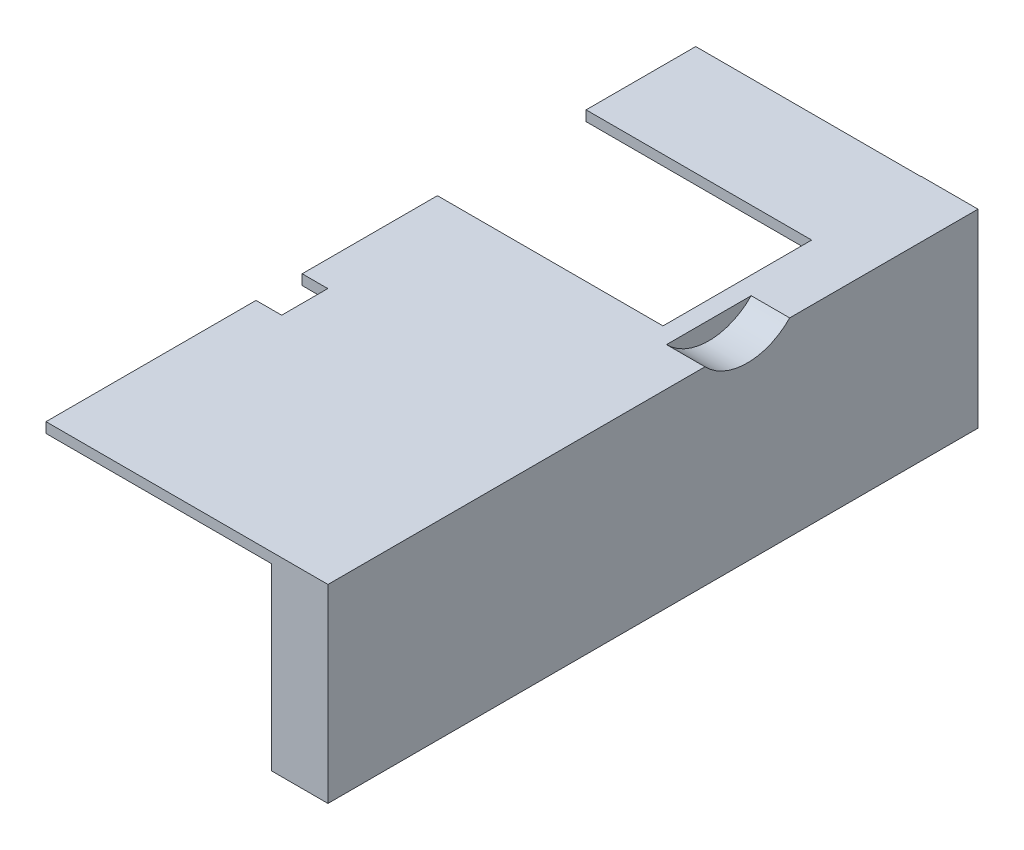
ISO-10303-21;
HEADER;
FILE_DESCRIPTION(('STEP AP214'),'2;1');
FILE_NAME('part.step','',(''),(''),'','','');
FILE_SCHEMA(('AUTOMOTIVE_DESIGN { 1 0 10303 214 1 1 1 1 }'));
ENDSEC;
DATA;
#1=APPLICATION_CONTEXT('core data for automotive mechanical design processes');
#2=APPLICATION_PROTOCOL_DEFINITION('international standard','automotive_design',2000,#1);
#3=PRODUCT_CONTEXT('',#1,'mechanical');
#4=PRODUCT('Part','Part','',(#3));
#5=PRODUCT_RELATED_PRODUCT_CATEGORY('part','',(#4));
#6=PRODUCT_DEFINITION_FORMATION('','',#4);
#7=PRODUCT_DEFINITION_CONTEXT('part definition',#1,'design');
#8=PRODUCT_DEFINITION('design','',#6,#7);
#9=PRODUCT_DEFINITION_SHAPE('','',#8);
#10=(LENGTH_UNIT() NAMED_UNIT(*) SI_UNIT(.MILLI.,.METRE.));
#11=(NAMED_UNIT(*) PLANE_ANGLE_UNIT() SI_UNIT($,.RADIAN.));
#12=(NAMED_UNIT(*) SI_UNIT($,.STERADIAN.) SOLID_ANGLE_UNIT());
#13=UNCERTAINTY_MEASURE_WITH_UNIT(LENGTH_MEASURE(1.E-05),#10,'distance_accuracy_value','');
#14=(GEOMETRIC_REPRESENTATION_CONTEXT(3) GLOBAL_UNCERTAINTY_ASSIGNED_CONTEXT((#13)) GLOBAL_UNIT_ASSIGNED_CONTEXT((#10,
#11,#12)) REPRESENTATION_CONTEXT('',''));
#15=CARTESIAN_POINT('',(0.,0.,0.));
#16=DIRECTION('',(0.,0.,1.));
#17=DIRECTION('',(1.,0.,0.));
#18=AXIS2_PLACEMENT_3D('',#15,#16,#17);
#19=CARTESIAN_POINT('',(52.5,-23.5,-45.0594239487394));
#20=DIRECTION('',(0.,0.,-1.));
#21=DIRECTION('',(-1.,0.,0.));
#22=AXIS2_PLACEMENT_3D('',#19,#20,#21);
#23=PLANE('',#22);
#24=DIRECTION('',(-1.,0.,0.));
#25=VECTOR('',#24,1.);
#26=CARTESIAN_POINT('',(52.5,-26.5,-45.0594239487394));
#27=LINE('',#26,#25);
#28=CARTESIAN_POINT('',(63.5,-26.5,-45.0594239487394));
#29=VERTEX_POINT('',#28);
#30=CARTESIAN_POINT('',(52.5,-26.5,-45.0594239487394));
#31=VERTEX_POINT('',#30);
#32=EDGE_CURVE('E224',#29,#31,#27,.T.);
#33=ORIENTED_EDGE('',*,*,#32,.F.);
#34=DIRECTION('',(0.,1.,0.));
#35=VECTOR('',#34,1.);
#36=CARTESIAN_POINT('',(63.5,-23.5,-45.0594239487394));
#37=LINE('',#36,#35);
#38=CARTESIAN_POINT('',(63.5,-63.5,-45.0594239487394));
#39=VERTEX_POINT('',#38);
#40=EDGE_CURVE('E246',#39,#29,#37,.T.);
#41=ORIENTED_EDGE('',*,*,#40,.F.);
#42=DIRECTION('',(1.,0.,0.));
#43=VECTOR('',#42,1.);
#44=CARTESIAN_POINT('',(52.5,-63.5,-45.0594239487394));
#45=LINE('',#44,#43);
#46=CARTESIAN_POINT('',(52.5,-63.5,-45.0594239487394));
#47=VERTEX_POINT('',#46);
#48=EDGE_CURVE('E240',#47,#39,#45,.T.);
#49=ORIENTED_EDGE('',*,*,#48,.F.);
#50=DIRECTION('',(0.,1.,0.));
#51=VECTOR('',#50,1.);
#52=CARTESIAN_POINT('',(52.5,-23.5,-45.0594239487394));
#53=LINE('',#52,#51);
#54=EDGE_CURVE('E251',#47,#31,#53,.T.);
#55=ORIENTED_EDGE('',*,*,#54,.T.);
#56=EDGE_LOOP('',(#33,#41,#49,#55));
#57=FACE_BOUND('',#56,.T.);
#58=ADVANCED_FACE('F36',(#57),#23,.T.);
#59=CARTESIAN_POINT('',(0.,-28.5,0.));
#60=DIRECTION('',(0.,-1.,0.));
#61=DIRECTION('',(0.,0.,-1.));
#62=AXIS2_PLACEMENT_3D('',#59,#60,#61);
#63=PLANE('',#62);
#64=DIRECTION('',(0.,0.,1.));
#65=VECTOR('',#64,1.);
#66=CARTESIAN_POINT('',(13.5,-28.5,0.));
#67=LINE('',#66,#65);
#68=CARTESIAN_POINT('',(13.5,-28.5,31.7691840241398));
#69=VERTEX_POINT('',#68);
#70=CARTESIAN_POINT('',(13.5,-28.5,40.7691840241398));
#71=VERTEX_POINT('',#70);
#72=EDGE_CURVE('E332',#69,#71,#67,.T.);
#73=ORIENTED_EDGE('',*,*,#72,.F.);
#74=DIRECTION('',(1.,0.,0.));
#75=VECTOR('',#74,1.);
#76=CARTESIAN_POINT('',(0.,-28.5,31.7691840241398));
#77=LINE('',#76,#75);
#78=CARTESIAN_POINT('',(8.5,-28.5,31.7691840241398));
#79=VERTEX_POINT('',#78);
#80=EDGE_CURVE('E194',#79,#69,#77,.T.);
#81=ORIENTED_EDGE('',*,*,#80,.F.);
#82=DIRECTION('',(0.,0.,1.));
#83=VECTOR('',#82,1.);
#84=CARTESIAN_POINT('',(8.5,-28.5,0.));
#85=LINE('',#84,#83);
#86=CARTESIAN_POINT('',(8.5,-28.5,5.38666652696871));
#87=VERTEX_POINT('',#86);
#88=EDGE_CURVE('E170',#87,#79,#85,.T.);
#89=ORIENTED_EDGE('',*,*,#88,.F.);
#90=DIRECTION('',(-1.,0.,0.));
#91=VECTOR('',#90,1.);
#92=CARTESIAN_POINT('',(0.,-28.5,5.38666652696871));
#93=LINE('',#92,#91);
#94=CARTESIAN_POINT('',(52.5,-28.5,5.38666652696871));
#95=VERTEX_POINT('',#94);
#96=EDGE_CURVE('E277',#95,#87,#93,.T.);
#97=ORIENTED_EDGE('',*,*,#96,.F.);
#98=DIRECTION('',(0.,0.,-1.));
#99=VECTOR('',#98,1.);
#100=CARTESIAN_POINT('',(52.5,-28.5,0.));
#101=LINE('',#100,#99);
#102=CARTESIAN_POINT('',(52.5,-28.5,81.7371530385704));
#103=VERTEX_POINT('',#102);
#104=EDGE_CURVE('E265',#103,#95,#101,.T.);
#105=ORIENTED_EDGE('',*,*,#104,.F.);
#106=DIRECTION('',(1.,0.,0.));
#107=VECTOR('',#106,1.);
#108=CARTESIAN_POINT('',(57.5,-28.5,81.7371530385704));
#109=LINE('',#108,#107);
#110=CARTESIAN_POINT('',(8.5,-28.5,81.7371530385704));
#111=VERTEX_POINT('',#110);
#112=EDGE_CURVE('E259',#111,#103,#109,.T.);
#113=ORIENTED_EDGE('',*,*,#112,.F.);
#114=DIRECTION('',(0.,0.,-1.));
#115=VECTOR('',#114,1.);
#116=CARTESIAN_POINT('',(8.5,-28.5,0.));
#117=LINE('',#116,#115);
#118=CARTESIAN_POINT('',(8.5,-28.5,40.7691840241398));
#119=VERTEX_POINT('',#118);
#120=EDGE_CURVE('E318',#111,#119,#117,.T.);
#121=ORIENTED_EDGE('',*,*,#120,.T.);
#122=DIRECTION('',(1.,0.,0.));
#123=VECTOR('',#122,1.);
#124=CARTESIAN_POINT('',(0.,-28.5,40.7691840241398));
#125=LINE('',#124,#123);
#126=EDGE_CURVE('E334',#119,#71,#125,.T.);
#127=ORIENTED_EDGE('',*,*,#126,.T.);
#128=EDGE_LOOP('',(#73,#81,#89,#97,#105,#113,#121,#127));
#129=FACE_BOUND('',#128,.T.);
#130=ADVANCED_FACE('F38',(#129),#63,.T.);
#131=CARTESIAN_POINT('',(57.5,-23.5,-45.));
#132=DIRECTION('',(0.,0.,-1.));
#133=DIRECTION('',(-1.,0.,0.));
#134=AXIS2_PLACEMENT_3D('',#131,#132,#133);
#135=PLANE('',#134);
#136=DIRECTION('',(-1.,0.,0.));
#137=VECTOR('',#136,1.);
#138=CARTESIAN_POINT('',(57.5,-26.5,-45.));
#139=LINE('',#138,#137);
#140=CARTESIAN_POINT('',(52.5,-26.5,-45.));
#141=VERTEX_POINT('',#140);
#142=CARTESIAN_POINT('',(8.5,-26.5,-45.));
#143=VERTEX_POINT('',#142);
#144=EDGE_CURVE('E221',#141,#143,#139,.T.);
#145=ORIENTED_EDGE('',*,*,#144,.F.);
#146=DIRECTION('',(0.,-1.,0.));
#147=VECTOR('',#146,1.);
#148=CARTESIAN_POINT('',(52.5,-23.5,-45.));
#149=LINE('',#148,#147);
#150=CARTESIAN_POINT('',(52.5,-28.5,-45.));
#151=VERTEX_POINT('',#150);
#152=EDGE_CURVE('E165',#141,#151,#149,.T.);
#153=ORIENTED_EDGE('',*,*,#152,.T.);
#154=DIRECTION('',(-1.,0.,0.));
#155=VECTOR('',#154,1.);
#156=CARTESIAN_POINT('',(57.5,-28.5,-45.));
#157=LINE('',#156,#155);
#158=CARTESIAN_POINT('',(8.5,-28.5,-45.));
#159=VERTEX_POINT('',#158);
#160=EDGE_CURVE('E157',#151,#159,#157,.T.);
#161=ORIENTED_EDGE('',*,*,#160,.T.);
#162=DIRECTION('',(0.,1.,0.));
#163=VECTOR('',#162,1.);
#164=CARTESIAN_POINT('',(8.5,-67.8962932320217,-45.));
#165=LINE('',#164,#163);
#166=EDGE_CURVE('E162',#159,#143,#165,.T.);
#167=ORIENTED_EDGE('',*,*,#166,.T.);
#168=EDGE_LOOP('',(#145,#153,#161,#167));
#169=FACE_BOUND('',#168,.T.);
#170=ADVANCED_FACE('F160',(#169),#135,.T.);
#171=DIRECTION('',(1.,0.,0.));
#172=VECTOR('',#171,1.);
#173=CARTESIAN_POINT('',(0.,-28.5,-23.6133334730313));
#174=LINE('',#173,#172);
#175=CARTESIAN_POINT('',(8.5,-28.5,-23.6133334730313));
#176=VERTEX_POINT('',#175);
#177=CARTESIAN_POINT('',(52.5,-28.5,-23.6133334730313));
#178=VERTEX_POINT('',#177);
#179=EDGE_CURVE('E175',#176,#178,#174,.T.);
#180=ORIENTED_EDGE('',*,*,#179,.F.);
#181=DIRECTION('',(0.,0.,1.));
#182=VECTOR('',#181,1.);
#183=CARTESIAN_POINT('',(8.5,-28.5,-45.));
#184=LINE('',#183,#182);
#185=EDGE_CURVE('E173',#159,#176,#184,.T.);
#186=ORIENTED_EDGE('',*,*,#185,.F.);
#187=ORIENTED_EDGE('',*,*,#160,.F.);
#188=DIRECTION('',(0.,0.,1.));
#189=VECTOR('',#188,1.);
#190=CARTESIAN_POINT('',(52.5,-28.5,0.));
#191=LINE('',#190,#189);
#192=EDGE_CURVE('E46',#151,#178,#191,.T.);
#193=ORIENTED_EDGE('',*,*,#192,.T.);
#194=EDGE_LOOP('',(#180,#186,#187,#193));
#195=FACE_BOUND('',#194,.T.);
#196=ADVANCED_FACE('F174',(#195),#63,.T.);
#197=CARTESIAN_POINT('',(8.5,0.,0.));
#198=DIRECTION('',(-1.,0.,0.));
#199=DIRECTION('',(0.,0.,1.));
#200=AXIS2_PLACEMENT_3D('',#197,#198,#199);
#201=PLANE('',#200);
#202=DIRECTION('',(0.,1.,0.));
#203=VECTOR('',#202,1.);
#204=CARTESIAN_POINT('',(8.5,-34.,31.7691840241398));
#205=LINE('',#204,#203);
#206=CARTESIAN_POINT('',(8.5,-26.5,31.7691840241398));
#207=VERTEX_POINT('',#206);
#208=EDGE_CURVE('E191',#79,#207,#205,.T.);
#209=ORIENTED_EDGE('',*,*,#208,.T.);
#210=DIRECTION('',(0.,0.,1.));
#211=VECTOR('',#210,1.);
#212=CARTESIAN_POINT('',(8.5,-26.5,-66.7628469614296));
#213=LINE('',#212,#211);
#214=CARTESIAN_POINT('',(8.5,-26.5,5.38666652696872));
#215=VERTEX_POINT('',#214);
#216=EDGE_CURVE('E211',#215,#207,#213,.T.);
#217=ORIENTED_EDGE('',*,*,#216,.F.);
#218=DIRECTION('',(0.,1.,0.));
#219=VECTOR('',#218,1.);
#220=CARTESIAN_POINT('',(8.5,0.,5.38666652696871));
#221=LINE('',#220,#219);
#222=EDGE_CURVE('E169',#87,#215,#221,.T.);
#223=ORIENTED_EDGE('',*,*,#222,.F.);
#224=ORIENTED_EDGE('',*,*,#88,.T.);
#225=EDGE_LOOP('',(#209,#217,#223,#224));
#226=FACE_BOUND('',#225,.T.);
#227=ADVANCED_FACE('F326',(#226),#201,.T.);
#228=CARTESIAN_POINT('',(13.5,-28.5,0.));
#229=DIRECTION('',(-1.,0.,0.));
#230=DIRECTION('',(0.,0.,1.));
#231=AXIS2_PLACEMENT_3D('',#228,#229,#230);
#232=PLANE('',#231);
#233=DIRECTION('',(0.,0.,1.));
#234=VECTOR('',#233,1.);
#235=CARTESIAN_POINT('',(13.5,-26.5,0.));
#236=LINE('',#235,#234);
#237=CARTESIAN_POINT('',(13.5,-26.5,31.7691840241398));
#238=VERTEX_POINT('',#237);
#239=CARTESIAN_POINT('',(13.5,-26.5,40.7691840241398));
#240=VERTEX_POINT('',#239);
#241=EDGE_CURVE('E53',#238,#240,#236,.T.);
#242=ORIENTED_EDGE('',*,*,#241,.F.);
#243=DIRECTION('',(0.,1.,0.));
#244=VECTOR('',#243,1.);
#245=CARTESIAN_POINT('',(13.5,-34.,31.7691840241398));
#246=LINE('',#245,#244);
#247=EDGE_CURVE('E190',#69,#238,#246,.T.);
#248=ORIENTED_EDGE('',*,*,#247,.F.);
#249=ORIENTED_EDGE('',*,*,#72,.T.);
#250=DIRECTION('',(0.,1.,0.));
#251=VECTOR('',#250,1.);
#252=CARTESIAN_POINT('',(13.5,-28.5,40.7691840241398));
#253=LINE('',#252,#251);
#254=EDGE_CURVE('E269',#71,#240,#253,.T.);
#255=ORIENTED_EDGE('',*,*,#254,.T.);
#256=EDGE_LOOP('',(#242,#248,#249,#255));
#257=FACE_BOUND('',#256,.T.);
#258=ADVANCED_FACE('F331',(#257),#232,.T.);
#259=CARTESIAN_POINT('',(0.,-28.5,40.7691840241398));
#260=DIRECTION('',(0.,0.,1.));
#261=DIRECTION('',(1.,0.,0.));
#262=AXIS2_PLACEMENT_3D('',#259,#260,#261);
#263=PLANE('',#262);
#264=DIRECTION('',(0.,-1.,0.));
#265=VECTOR('',#264,1.);
#266=CARTESIAN_POINT('',(8.5,-28.5,40.7691840241398));
#267=LINE('',#266,#265);
#268=CARTESIAN_POINT('',(8.5,-26.5,40.7691840241398));
#269=VERTEX_POINT('',#268);
#270=EDGE_CURVE('E273',#269,#119,#267,.T.);
#271=ORIENTED_EDGE('',*,*,#270,.F.);
#272=DIRECTION('',(1.,0.,0.));
#273=VECTOR('',#272,1.);
#274=CARTESIAN_POINT('',(0.,-26.5,40.7691840241398));
#275=LINE('',#274,#273);
#276=EDGE_CURVE('E226',#269,#240,#275,.T.);
#277=ORIENTED_EDGE('',*,*,#276,.T.);
#278=ORIENTED_EDGE('',*,*,#254,.F.);
#279=ORIENTED_EDGE('',*,*,#126,.F.);
#280=EDGE_LOOP('',(#271,#277,#278,#279));
#281=FACE_BOUND('',#280,.T.);
#282=ADVANCED_FACE('F342',(#281),#263,.F.);
#283=CARTESIAN_POINT('',(8.5,-26.5,81.7371530385704));
#284=VERTEX_POINT('',#283);
#285=EDGE_CURVE('E206',#269,#284,#213,.T.);
#286=ORIENTED_EDGE('',*,*,#285,.F.);
#287=ORIENTED_EDGE('',*,*,#270,.T.);
#288=ORIENTED_EDGE('',*,*,#120,.F.);
#289=DIRECTION('',(0.,1.,0.));
#290=VECTOR('',#289,1.);
#291=CARTESIAN_POINT('',(8.5,-28.5,81.7371530385704));
#292=LINE('',#291,#290);
#293=EDGE_CURVE('E262',#111,#284,#292,.T.);
#294=ORIENTED_EDGE('',*,*,#293,.T.);
#295=EDGE_LOOP('',(#286,#287,#288,#294));
#296=FACE_BOUND('',#295,.T.);
#297=ADVANCED_FACE('F340',(#296),#201,.T.);
#298=CARTESIAN_POINT('',(57.5,-28.5,81.7371530385704));
#299=DIRECTION('',(0.,0.,1.));
#300=DIRECTION('',(1.,0.,0.));
#301=AXIS2_PLACEMENT_3D('',#298,#299,#300);
#302=PLANE('',#301);
#303=DIRECTION('',(1.,0.,0.));
#304=VECTOR('',#303,1.);
#305=CARTESIAN_POINT('',(8.5,-26.5,81.7371530385704));
#306=LINE('',#305,#304);
#307=CARTESIAN_POINT('',(63.5,-26.5,81.7371530385704));
#308=VERTEX_POINT('',#307);
#309=EDGE_CURVE('E204',#284,#308,#306,.T.);
#310=ORIENTED_EDGE('',*,*,#309,.F.);
#311=ORIENTED_EDGE('',*,*,#293,.F.);
#312=ORIENTED_EDGE('',*,*,#112,.T.);
#313=DIRECTION('',(0.,-1.,0.));
#314=VECTOR('',#313,1.);
#315=CARTESIAN_POINT('',(52.5,-23.5,81.7371530385704));
#316=LINE('',#315,#314);
#317=CARTESIAN_POINT('',(52.5,-63.5,81.7371530385704));
#318=VERTEX_POINT('',#317);
#319=EDGE_CURVE('E248',#103,#318,#316,.T.);
#320=ORIENTED_EDGE('',*,*,#319,.T.);
#321=DIRECTION('',(1.,0.,0.));
#322=VECTOR('',#321,1.);
#323=CARTESIAN_POINT('',(52.5,-63.5,81.7371530385704));
#324=LINE('',#323,#322);
#325=CARTESIAN_POINT('',(63.5,-63.5,81.7371530385704));
#326=VERTEX_POINT('',#325);
#327=EDGE_CURVE('E243',#318,#326,#324,.T.);
#328=ORIENTED_EDGE('',*,*,#327,.T.);
#329=DIRECTION('',(0.,-1.,0.));
#330=VECTOR('',#329,1.);
#331=CARTESIAN_POINT('',(63.5,-23.5,81.7371530385704));
#332=LINE('',#331,#330);
#333=EDGE_CURVE('E257',#308,#326,#332,.T.);
#334=ORIENTED_EDGE('',*,*,#333,.F.);
#335=EDGE_LOOP('',(#310,#311,#312,#320,#328,#334));
#336=FACE_BOUND('',#335,.T.);
#337=ADVANCED_FACE('F311',(#336),#302,.T.);
#338=CARTESIAN_POINT('',(52.5,-23.5,5.));
#339=DIRECTION('',(1.,0.,0.));
#340=DIRECTION('',(0.,0.,-1.));
#341=AXIS2_PLACEMENT_3D('',#338,#339,#340);
#342=PLANE('',#341);
#343=DIRECTION('',(0.,1.,0.));
#344=VECTOR('',#343,1.);
#345=CARTESIAN_POINT('',(52.5,-34.,-23.6133334730313));
#346=LINE('',#345,#344);
#347=CARTESIAN_POINT('',(52.5,-26.5,-23.6133334730313));
#348=VERTEX_POINT('',#347);
#349=EDGE_CURVE('E200',#178,#348,#346,.T.);
#350=ORIENTED_EDGE('',*,*,#349,.F.);
#351=ORIENTED_EDGE('',*,*,#192,.F.);
#352=ORIENTED_EDGE('',*,*,#152,.F.);
#353=DIRECTION('',(0.,0.,-1.));
#354=VECTOR('',#353,1.);
#355=CARTESIAN_POINT('',(52.5,-26.5,5.));
#356=LINE('',#355,#354);
#357=EDGE_CURVE('E222',#141,#31,#356,.T.);
#358=ORIENTED_EDGE('',*,*,#357,.T.);
#359=ORIENTED_EDGE('',*,*,#54,.F.);
#360=DIRECTION('',(0.,0.,1.));
#361=VECTOR('',#360,1.);
#362=CARTESIAN_POINT('',(52.5,-63.5,81.7371530385704));
#363=LINE('',#362,#361);
#364=EDGE_CURVE('E237',#47,#318,#363,.T.);
#365=ORIENTED_EDGE('',*,*,#364,.T.);
#366=ORIENTED_EDGE('',*,*,#319,.F.);
#367=ORIENTED_EDGE('',*,*,#104,.T.);
#368=DIRECTION('',(0.,-1.,0.));
#369=VECTOR('',#368,1.);
#370=CARTESIAN_POINT('',(52.5,-28.5,5.38666652696871));
#371=LINE('',#370,#369);
#372=CARTESIAN_POINT('',(52.5,-26.5,5.38666652696871));
#373=VERTEX_POINT('',#372);
#374=EDGE_CURVE('E40',#373,#95,#371,.T.);
#375=ORIENTED_EDGE('',*,*,#374,.F.);
#376=EDGE_CURVE('E219',#373,#348,#356,.T.);
#377=ORIENTED_EDGE('',*,*,#376,.T.);
#378=EDGE_LOOP('',(#350,#351,#352,#358,#359,#365,#366,#367,#375,#377));
#379=FACE_BOUND('',#378,.T.);
#380=ADVANCED_FACE('F287',(#379),#342,.F.);
#381=CARTESIAN_POINT('',(0.,-28.5,5.38666652696871));
#382=DIRECTION('',(0.,0.,-1.));
#383=DIRECTION('',(-1.,0.,0.));
#384=AXIS2_PLACEMENT_3D('',#381,#382,#383);
#385=PLANE('',#384);
#386=DIRECTION('',(-1.,0.,0.));
#387=VECTOR('',#386,1.);
#388=CARTESIAN_POINT('',(0.,-26.5,5.38666652696871));
#389=LINE('',#388,#387);
#390=EDGE_CURVE('E217',#373,#215,#389,.T.);
#391=ORIENTED_EDGE('',*,*,#390,.F.);
#392=ORIENTED_EDGE('',*,*,#374,.T.);
#393=ORIENTED_EDGE('',*,*,#96,.T.);
#394=ORIENTED_EDGE('',*,*,#222,.T.);
#395=EDGE_LOOP('',(#391,#392,#393,#394));
#396=FACE_BOUND('',#395,.T.);
#397=ADVANCED_FACE('F323',(#396),#385,.T.);
#398=CARTESIAN_POINT('',(63.5,-18.5,1.38666652696873));
#399=DIRECTION('',(1.,0.,0.));
#400=DIRECTION('',(0.,0.,-1.));
#401=AXIS2_PLACEMENT_3D('',#398,#399,#400);
#402=PLANE('',#401);
#403=DIRECTION('',(0.,0.,1.));
#404=VECTOR('',#403,1.);
#405=CARTESIAN_POINT('',(63.5,-26.5,-66.7628469614296));
#406=LINE('',#405,#404);
#407=CARTESIAN_POINT('',(63.5,-26.5,8.2019318721898));
#408=VERTEX_POINT('',#407);
#409=EDGE_CURVE('E207',#408,#308,#406,.T.);
#410=ORIENTED_EDGE('',*,*,#409,.T.);
#411=ORIENTED_EDGE('',*,*,#333,.T.);
#412=DIRECTION('',(0.,0.,1.));
#413=VECTOR('',#412,1.);
#414=CARTESIAN_POINT('',(63.5,-63.5,81.7371530385704));
#415=LINE('',#414,#413);
#416=EDGE_CURVE('E234',#39,#326,#415,.T.);
#417=ORIENTED_EDGE('',*,*,#416,.F.);
#418=ORIENTED_EDGE('',*,*,#40,.T.);
#419=CARTESIAN_POINT('',(63.5,-26.5,-8.32077976966851));
#420=VERTEX_POINT('',#419);
#421=EDGE_CURVE('E210',#29,#420,#406,.T.);
#422=ORIENTED_EDGE('',*,*,#421,.T.);
#423=CARTESIAN_POINT('',(63.5,-18.5,-0.0594239487393539));
#424=DIRECTION('',(1.,0.,0.));
#425=DIRECTION('',(0.,0.,-1.));
#426=AXIS2_PLACEMENT_3D('',#423,#424,#425);
#427=CIRCLE('',#426,11.5);
#428=EDGE_CURVE('E230',#408,#420,#427,.T.);
#429=ORIENTED_EDGE('',*,*,#428,.F.);
#430=EDGE_LOOP('',(#410,#411,#417,#418,#422,#429));
#431=FACE_BOUND('',#430,.T.);
#432=ADVANCED_FACE('F305',(#431),#402,.T.);
#433=CARTESIAN_POINT('',(52.5,-63.5,81.7371530385704));
#434=DIRECTION('',(0.,1.,0.));
#435=DIRECTION('',(0.,0.,1.));
#436=AXIS2_PLACEMENT_3D('',#433,#434,#435);
#437=PLANE('',#436);
#438=ORIENTED_EDGE('',*,*,#416,.T.);
#439=ORIENTED_EDGE('',*,*,#327,.F.);
#440=ORIENTED_EDGE('',*,*,#364,.F.);
#441=ORIENTED_EDGE('',*,*,#48,.T.);
#442=EDGE_LOOP('',(#438,#439,#440,#441));
#443=FACE_BOUND('',#442,.T.);
#444=ADVANCED_FACE('F303',(#443),#437,.F.);
#445=CARTESIAN_POINT('',(56.,-18.5,-0.0594239487393539));
#446=DIRECTION('',(1.,0.,0.));
#447=DIRECTION('',(0.,0.,-1.));
#448=AXIS2_PLACEMENT_3D('',#445,#446,#447);
#449=CYLINDRICAL_SURFACE('',#448,11.5);
#450=ORIENTED_EDGE('',*,*,#428,.T.);
#451=DIRECTION('',(1.,0.,0.));
#452=VECTOR('',#451,1.);
#453=CARTESIAN_POINT('',(56.,-26.5,-8.32077976966851));
#454=LINE('',#453,#452);
#455=CARTESIAN_POINT('',(56.,-26.5,-8.32077976966851));
#456=VERTEX_POINT('',#455);
#457=EDGE_CURVE('E214',#420,#456,#454,.F.);
#458=ORIENTED_EDGE('',*,*,#457,.T.);
#459=CARTESIAN_POINT('',(56.,-18.5,-0.0594239487393539));
#460=DIRECTION('',(1.,0.,0.));
#461=DIRECTION('',(0.,0.,-1.));
#462=AXIS2_PLACEMENT_3D('',#459,#460,#461);
#463=CIRCLE('',#462,11.5);
#464=CARTESIAN_POINT('',(56.,-26.5,8.2019318721898));
#465=VERTEX_POINT('',#464);
#466=EDGE_CURVE('E231',#465,#456,#463,.T.);
#467=ORIENTED_EDGE('',*,*,#466,.F.);
#468=DIRECTION('',(1.,0.,0.));
#469=VECTOR('',#468,1.);
#470=CARTESIAN_POINT('',(56.,-26.5,8.2019318721898));
#471=LINE('',#470,#469);
#472=EDGE_CURVE('E60',#465,#408,#471,.T.);
#473=ORIENTED_EDGE('',*,*,#472,.T.);
#474=EDGE_LOOP('',(#450,#458,#467,#473));
#475=FACE_BOUND('',#474,.T.);
#476=ADVANCED_FACE('F345',(#475),#449,.F.);
#477=CARTESIAN_POINT('',(56.,-18.5,-0.0594239487393539));
#478=DIRECTION('',(1.,0.,0.));
#479=DIRECTION('',(0.,0.,-1.));
#480=AXIS2_PLACEMENT_3D('',#477,#478,#479);
#481=PLANE('',#480);
#482=DIRECTION('',(0.,0.,-1.));
#483=VECTOR('',#482,1.);
#484=CARTESIAN_POINT('',(56.,-26.5,-0.0594239487393539));
#485=LINE('',#484,#483);
#486=EDGE_CURVE('E11',#465,#456,#485,.T.);
#487=ORIENTED_EDGE('',*,*,#486,.F.);
#488=ORIENTED_EDGE('',*,*,#466,.T.);
#489=EDGE_LOOP('',(#487,#488));
#490=FACE_BOUND('',#489,.T.);
#491=ADVANCED_FACE('F347',(#490),#481,.T.);
#492=CARTESIAN_POINT('',(8.5,-26.5,-66.7628469614296));
#493=DIRECTION('',(0.,-1.,0.));
#494=DIRECTION('',(0.,0.,-1.));
#495=AXIS2_PLACEMENT_3D('',#492,#493,#494);
#496=PLANE('',#495);
#497=DIRECTION('',(-1.,0.,0.));
#498=VECTOR('',#497,1.);
#499=CARTESIAN_POINT('',(13.5,-26.5,31.7691840241398));
#500=LINE('',#499,#498);
#501=EDGE_CURVE('E188',#238,#207,#500,.T.);
#502=ORIENTED_EDGE('',*,*,#501,.F.);
#503=ORIENTED_EDGE('',*,*,#241,.T.);
#504=ORIENTED_EDGE('',*,*,#276,.F.);
#505=ORIENTED_EDGE('',*,*,#285,.T.);
#506=ORIENTED_EDGE('',*,*,#309,.T.);
#507=ORIENTED_EDGE('',*,*,#409,.F.);
#508=ORIENTED_EDGE('',*,*,#472,.F.);
#509=ORIENTED_EDGE('',*,*,#486,.T.);
#510=ORIENTED_EDGE('',*,*,#457,.F.);
#511=ORIENTED_EDGE('',*,*,#421,.F.);
#512=ORIENTED_EDGE('',*,*,#32,.T.);
#513=ORIENTED_EDGE('',*,*,#357,.F.);
#514=ORIENTED_EDGE('',*,*,#144,.T.);
#515=DIRECTION('',(0.,0.,1.));
#516=VECTOR('',#515,1.);
#517=CARTESIAN_POINT('',(8.5,-26.5,-45.));
#518=LINE('',#517,#516);
#519=CARTESIAN_POINT('',(8.5,-26.5,-23.6133334730313));
#520=VERTEX_POINT('',#519);
#521=EDGE_CURVE('E183',#143,#520,#518,.T.);
#522=ORIENTED_EDGE('',*,*,#521,.T.);
#523=DIRECTION('',(-1.,0.,0.));
#524=VECTOR('',#523,1.);
#525=CARTESIAN_POINT('',(41.5859247307322,-26.5,-23.6133334730313));
#526=LINE('',#525,#524);
#527=EDGE_CURVE('E198',#348,#520,#526,.T.);
#528=ORIENTED_EDGE('',*,*,#527,.F.);
#529=ORIENTED_EDGE('',*,*,#376,.F.);
#530=ORIENTED_EDGE('',*,*,#390,.T.);
#531=ORIENTED_EDGE('',*,*,#216,.T.);
#532=EDGE_LOOP('',(#502,#503,#504,#505,#506,#507,#508,#509,#510,#511,#512,#513,#514,#522,#528,
#529,#530,#531));
#533=FACE_BOUND('',#532,.T.);
#534=ADVANCED_FACE('F294',(#533),#496,.F.);
#535=CARTESIAN_POINT('',(41.5859247307322,-34.,-23.6133334730313));
#536=DIRECTION('',(0.,0.,-1.));
#537=DIRECTION('',(-1.,0.,0.));
#538=AXIS2_PLACEMENT_3D('',#535,#536,#537);
#539=PLANE('',#538);
#540=ORIENTED_EDGE('',*,*,#179,.T.);
#541=ORIENTED_EDGE('',*,*,#349,.T.);
#542=ORIENTED_EDGE('',*,*,#527,.T.);
#543=DIRECTION('',(0.,1.,0.));
#544=VECTOR('',#543,1.);
#545=CARTESIAN_POINT('',(8.5,-67.8962932320217,-23.6133334730313));
#546=LINE('',#545,#544);
#547=EDGE_CURVE('E179',#176,#520,#546,.T.);
#548=ORIENTED_EDGE('',*,*,#547,.F.);
#549=EDGE_LOOP('',(#540,#541,#542,#548));
#550=FACE_BOUND('',#549,.T.);
#551=ADVANCED_FACE('F292',(#550),#539,.F.);
#552=CARTESIAN_POINT('',(13.5,-34.,31.7691840241398));
#553=DIRECTION('',(0.,0.,-1.));
#554=DIRECTION('',(-1.,0.,0.));
#555=AXIS2_PLACEMENT_3D('',#552,#553,#554);
#556=PLANE('',#555);
#557=ORIENTED_EDGE('',*,*,#80,.T.);
#558=ORIENTED_EDGE('',*,*,#247,.T.);
#559=ORIENTED_EDGE('',*,*,#501,.T.);
#560=ORIENTED_EDGE('',*,*,#208,.F.);
#561=EDGE_LOOP('',(#557,#558,#559,#560));
#562=FACE_BOUND('',#561,.T.);
#563=ADVANCED_FACE('F329',(#562),#556,.F.);
#564=CARTESIAN_POINT('',(8.5,-67.8962932320217,-45.));
#565=DIRECTION('',(-1.,0.,0.));
#566=DIRECTION('',(0.,0.,1.));
#567=AXIS2_PLACEMENT_3D('',#564,#565,#566);
#568=PLANE('',#567);
#569=ORIENTED_EDGE('',*,*,#166,.F.);
#570=ORIENTED_EDGE('',*,*,#185,.T.);
#571=ORIENTED_EDGE('',*,*,#547,.T.);
#572=ORIENTED_EDGE('',*,*,#521,.F.);
#573=EDGE_LOOP('',(#569,#570,#571,#572));
#574=FACE_BOUND('',#573,.T.);
#575=ADVANCED_FACE('F181',(#574),#568,.T.);
#576=CLOSED_SHELL('',(#58,#130,#170,#196,#227,#258,#282,#297,#337,#380,#397,#432,#444,#476,#491,
#534,#551,#563,#575));
#577=MANIFOLD_SOLID_BREP('B2',#576);
#578=ADVANCED_BREP_SHAPE_REPRESENTATION('',(#18,#577),#14);
#579=SHAPE_DEFINITION_REPRESENTATION(#9,#578);
ENDSEC;
END-ISO-10303-21;
